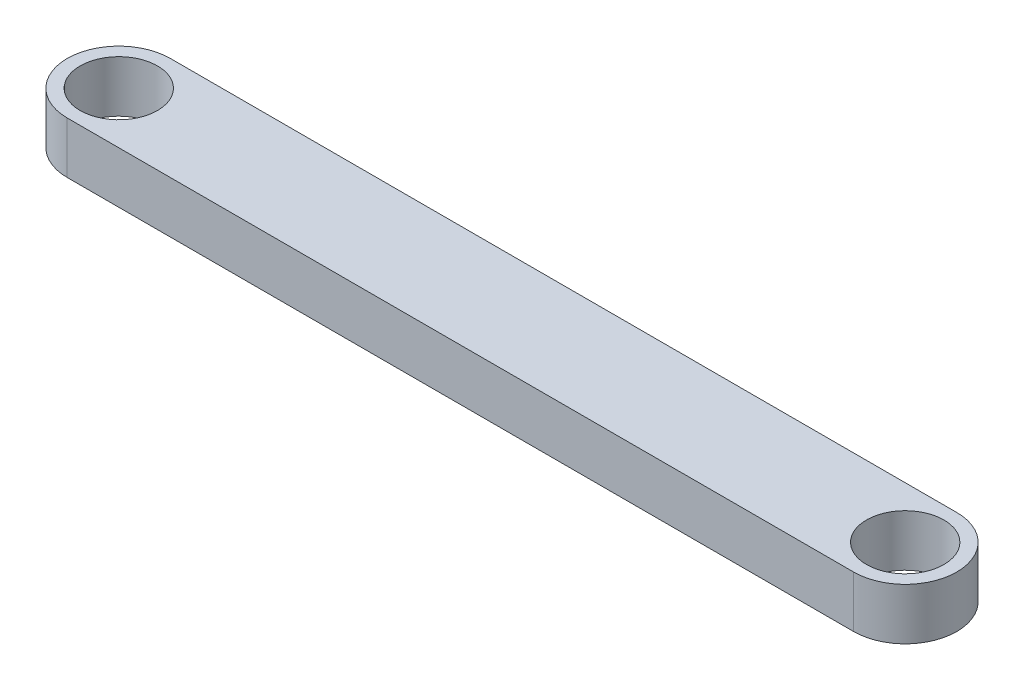
ISO-10303-21;
HEADER;
FILE_DESCRIPTION(('STEP AP214'),'2;1');
FILE_NAME('part.step','',(''),(''),'','','');
FILE_SCHEMA(('AUTOMOTIVE_DESIGN { 1 0 10303 214 1 1 1 1 }'));
ENDSEC;
DATA;
#1=APPLICATION_CONTEXT('core data for automotive mechanical design processes');
#2=APPLICATION_PROTOCOL_DEFINITION('international standard','automotive_design',2000,#1);
#3=PRODUCT_CONTEXT('',#1,'mechanical');
#4=PRODUCT('Part','Part','',(#3));
#5=PRODUCT_RELATED_PRODUCT_CATEGORY('part','',(#4));
#6=PRODUCT_DEFINITION_FORMATION('','',#4);
#7=PRODUCT_DEFINITION_CONTEXT('part definition',#1,'design');
#8=PRODUCT_DEFINITION('design','',#6,#7);
#9=PRODUCT_DEFINITION_SHAPE('','',#8);
#10=(LENGTH_UNIT() NAMED_UNIT(*) SI_UNIT(.MILLI.,.METRE.));
#11=(NAMED_UNIT(*) PLANE_ANGLE_UNIT() SI_UNIT($,.RADIAN.));
#12=(NAMED_UNIT(*) SI_UNIT($,.STERADIAN.) SOLID_ANGLE_UNIT());
#13=UNCERTAINTY_MEASURE_WITH_UNIT(LENGTH_MEASURE(1.E-05),#10,'distance_accuracy_value','');
#14=(GEOMETRIC_REPRESENTATION_CONTEXT(3) GLOBAL_UNCERTAINTY_ASSIGNED_CONTEXT((#13)) GLOBAL_UNIT_ASSIGNED_CONTEXT((#10,
#11,#12)) REPRESENTATION_CONTEXT('',''));
#15=CARTESIAN_POINT('',(0.,0.,0.));
#16=DIRECTION('',(0.,0.,1.));
#17=DIRECTION('',(1.,0.,0.));
#18=AXIS2_PLACEMENT_3D('',#15,#16,#17);
#19=CARTESIAN_POINT('',(-97.4301620899353,2.,-22.3368550491147));
#20=DIRECTION('',(0.,1.,0.));
#21=DIRECTION('',(0.,0.,1.));
#22=AXIS2_PLACEMENT_3D('',#19,#20,#21);
#23=PLANE('',#22);
#24=CARTESIAN_POINT('',(-97.4301620899353,2.,-22.3368550491147));
#25=DIRECTION('',(0.,1.,0.));
#26=DIRECTION('',(0.,0.,1.));
#27=AXIS2_PLACEMENT_3D('',#24,#25,#26);
#28=CIRCLE('',#27,1.5);
#29=CARTESIAN_POINT('',(-97.4301620899353,2.,-20.8368550491147));
#30=VERTEX_POINT('',#29);
#31=EDGE_CURVE('E104',#30,#30,#28,.T.);
#32=ORIENTED_EDGE('',*,*,#31,.F.);
#33=EDGE_LOOP('',(#32));
#34=FACE_BOUND('',#33,.T.);
#35=CARTESIAN_POINT('',(-97.4301620899353,2.,-22.3368550491147));
#36=DIRECTION('',(0.,1.,0.));
#37=DIRECTION('',(0.,0.,1.));
#38=AXIS2_PLACEMENT_3D('',#35,#36,#37);
#39=CIRCLE('',#38,1.99999999999999);
#40=CARTESIAN_POINT('',(-97.4301620899353,2.,-24.3368550491147));
#41=VERTEX_POINT('',#40);
#42=CARTESIAN_POINT('',(-97.4301620899353,2.,-20.3368550491147));
#43=VERTEX_POINT('',#42);
#44=EDGE_CURVE('E89',#41,#43,#39,.T.);
#45=ORIENTED_EDGE('',*,*,#44,.T.);
#46=DIRECTION('',(1.,0.,0.));
#47=VECTOR('',#46,1.);
#48=CARTESIAN_POINT('',(-66.9301620899353,2.,-20.3368550491147));
#49=LINE('',#48,#47);
#50=CARTESIAN_POINT('',(-66.9301620899353,2.,-20.3368550491147));
#51=VERTEX_POINT('',#50);
#52=EDGE_CURVE('E84',#43,#51,#49,.T.);
#53=ORIENTED_EDGE('',*,*,#52,.T.);
#54=CARTESIAN_POINT('',(-66.9301620899353,2.,-22.3368550491147));
#55=DIRECTION('',(0.,1.,0.));
#56=DIRECTION('',(0.,0.,1.));
#57=AXIS2_PLACEMENT_3D('',#54,#55,#56);
#58=CIRCLE('',#57,1.99999999999999);
#59=CARTESIAN_POINT('',(-66.9301620899353,2.,-24.3368550491147));
#60=VERTEX_POINT('',#59);
#61=EDGE_CURVE('E87',#51,#60,#58,.T.);
#62=ORIENTED_EDGE('',*,*,#61,.T.);
#63=DIRECTION('',(-1.,0.,0.));
#64=VECTOR('',#63,1.);
#65=CARTESIAN_POINT('',(-97.4301620899353,2.,-24.3368550491147));
#66=LINE('',#65,#64);
#67=EDGE_CURVE('E54',#60,#41,#66,.T.);
#68=ORIENTED_EDGE('',*,*,#67,.T.);
#69=EDGE_LOOP('',(#45,#53,#62,#68));
#70=FACE_BOUND('',#69,.T.);
#71=CARTESIAN_POINT('',(-66.9301620899353,2.,-22.3368550491147));
#72=DIRECTION('',(0.,1.,0.));
#73=DIRECTION('',(0.,0.,1.));
#74=AXIS2_PLACEMENT_3D('',#71,#72,#73);
#75=CIRCLE('',#74,1.5);
#76=CARTESIAN_POINT('',(-66.9301620899353,2.,-20.8368550491147));
#77=VERTEX_POINT('',#76);
#78=EDGE_CURVE('E119',#77,#77,#75,.T.);
#79=ORIENTED_EDGE('',*,*,#78,.F.);
#80=EDGE_LOOP('',(#79));
#81=FACE_BOUND('',#80,.T.);
#82=ADVANCED_FACE('F37',(#34,#70,#81),#23,.T.);
#83=CARTESIAN_POINT('',(-97.4301620899353,0.,-22.3368550491147));
#84=DIRECTION('',(0.,1.,0.));
#85=DIRECTION('',(0.,0.,1.));
#86=AXIS2_PLACEMENT_3D('',#83,#84,#85);
#87=PLANE('',#86);
#88=CARTESIAN_POINT('',(-97.4301620899353,0.,-22.3368550491147));
#89=DIRECTION('',(0.,1.,0.));
#90=DIRECTION('',(0.,0.,1.));
#91=AXIS2_PLACEMENT_3D('',#88,#89,#90);
#92=CIRCLE('',#91,1.99999999999999);
#93=CARTESIAN_POINT('',(-97.4301620899353,0.,-24.3368550491147));
#94=VERTEX_POINT('',#93);
#95=CARTESIAN_POINT('',(-97.4301620899353,0.,-20.3368550491147));
#96=VERTEX_POINT('',#95);
#97=EDGE_CURVE('E101',#94,#96,#92,.T.);
#98=ORIENTED_EDGE('',*,*,#97,.F.);
#99=DIRECTION('',(-1.,0.,0.));
#100=VECTOR('',#99,1.);
#101=CARTESIAN_POINT('',(-97.4301620899353,0.,-24.3368550491147));
#102=LINE('',#101,#100);
#103=CARTESIAN_POINT('',(-66.9301620899353,0.,-24.3368550491147));
#104=VERTEX_POINT('',#103);
#105=EDGE_CURVE('E77',#104,#94,#102,.T.);
#106=ORIENTED_EDGE('',*,*,#105,.F.);
#107=CARTESIAN_POINT('',(-66.9301620899353,0.,-22.3368550491147));
#108=DIRECTION('',(0.,1.,0.));
#109=DIRECTION('',(0.,0.,1.));
#110=AXIS2_PLACEMENT_3D('',#107,#108,#109);
#111=CIRCLE('',#110,1.99999999999999);
#112=CARTESIAN_POINT('',(-66.9301620899353,0.,-20.3368550491147));
#113=VERTEX_POINT('',#112);
#114=EDGE_CURVE('E71',#113,#104,#111,.T.);
#115=ORIENTED_EDGE('',*,*,#114,.F.);
#116=DIRECTION('',(1.,0.,0.));
#117=VECTOR('',#116,1.);
#118=CARTESIAN_POINT('',(-66.9301620899353,0.,-20.3368550491147));
#119=LINE('',#118,#117);
#120=EDGE_CURVE('E93',#96,#113,#119,.T.);
#121=ORIENTED_EDGE('',*,*,#120,.F.);
#122=EDGE_LOOP('',(#98,#106,#115,#121));
#123=FACE_BOUND('',#122,.T.);
#124=CARTESIAN_POINT('',(-97.4301620899353,0.,-22.3368550491147));
#125=DIRECTION('',(0.,1.,0.));
#126=DIRECTION('',(0.,0.,1.));
#127=AXIS2_PLACEMENT_3D('',#124,#125,#126);
#128=CIRCLE('',#127,1.5);
#129=CARTESIAN_POINT('',(-97.4301620899353,0.,-20.8368550491147));
#130=VERTEX_POINT('',#129);
#131=EDGE_CURVE('E116',#130,#130,#128,.T.);
#132=ORIENTED_EDGE('',*,*,#131,.T.);
#133=EDGE_LOOP('',(#132));
#134=FACE_BOUND('',#133,.T.);
#135=CARTESIAN_POINT('',(-66.9301620899353,0.,-22.3368550491147));
#136=DIRECTION('',(0.,1.,0.));
#137=DIRECTION('',(0.,0.,1.));
#138=AXIS2_PLACEMENT_3D('',#135,#136,#137);
#139=CIRCLE('',#138,1.5);
#140=CARTESIAN_POINT('',(-66.9301620899353,0.,-20.8368550491147));
#141=VERTEX_POINT('',#140);
#142=EDGE_CURVE('E122',#141,#141,#139,.T.);
#143=ORIENTED_EDGE('',*,*,#142,.T.);
#144=EDGE_LOOP('',(#143));
#145=FACE_BOUND('',#144,.T.);
#146=ADVANCED_FACE('F112',(#123,#134,#145),#87,.F.);
#147=CARTESIAN_POINT('',(-97.4301620899353,2.,-22.3368550491147));
#148=DIRECTION('',(0.,-1.,0.));
#149=DIRECTION('',(0.,0.,-1.));
#150=AXIS2_PLACEMENT_3D('',#147,#148,#149);
#151=CYLINDRICAL_SURFACE('',#150,1.99999999999999);
#152=ORIENTED_EDGE('',*,*,#97,.T.);
#153=DIRECTION('',(0.,-1.,0.));
#154=VECTOR('',#153,1.);
#155=CARTESIAN_POINT('',(-97.4301620899353,2.,-20.3368550491147));
#156=LINE('',#155,#154);
#157=EDGE_CURVE('E11',#43,#96,#156,.T.);
#158=ORIENTED_EDGE('',*,*,#157,.F.);
#159=ORIENTED_EDGE('',*,*,#44,.F.);
#160=DIRECTION('',(0.,-1.,0.));
#161=VECTOR('',#160,1.);
#162=CARTESIAN_POINT('',(-97.4301620899353,2.,-24.3368550491147));
#163=LINE('',#162,#161);
#164=EDGE_CURVE('E97',#41,#94,#163,.T.);
#165=ORIENTED_EDGE('',*,*,#164,.T.);
#166=EDGE_LOOP('',(#152,#158,#159,#165));
#167=FACE_BOUND('',#166,.T.);
#168=ADVANCED_FACE('F39',(#167),#151,.T.);
#169=CARTESIAN_POINT('',(-66.9301620899353,2.,-20.3368550491147));
#170=DIRECTION('',(0.,0.,-1.));
#171=DIRECTION('',(-1.,0.,0.));
#172=AXIS2_PLACEMENT_3D('',#169,#170,#171);
#173=PLANE('',#172);
#174=ORIENTED_EDGE('',*,*,#120,.T.);
#175=DIRECTION('',(0.,-1.,0.));
#176=VECTOR('',#175,1.);
#177=CARTESIAN_POINT('',(-66.9301620899353,2.,-20.3368550491147));
#178=LINE('',#177,#176);
#179=EDGE_CURVE('E46',#51,#113,#178,.T.);
#180=ORIENTED_EDGE('',*,*,#179,.F.);
#181=ORIENTED_EDGE('',*,*,#52,.F.);
#182=ORIENTED_EDGE('',*,*,#157,.T.);
#183=EDGE_LOOP('',(#174,#180,#181,#182));
#184=FACE_BOUND('',#183,.T.);
#185=ADVANCED_FACE('F92',(#184),#173,.F.);
#186=CARTESIAN_POINT('',(-66.9301620899353,2.,-22.3368550491147));
#187=DIRECTION('',(0.,-1.,0.));
#188=DIRECTION('',(0.,0.,-1.));
#189=AXIS2_PLACEMENT_3D('',#186,#187,#188);
#190=CYLINDRICAL_SURFACE('',#189,1.99999999999999);
#191=ORIENTED_EDGE('',*,*,#114,.T.);
#192=DIRECTION('',(0.,-1.,0.));
#193=VECTOR('',#192,1.);
#194=CARTESIAN_POINT('',(-66.9301620899353,2.,-24.3368550491147));
#195=LINE('',#194,#193);
#196=EDGE_CURVE('E94',#60,#104,#195,.T.);
#197=ORIENTED_EDGE('',*,*,#196,.F.);
#198=ORIENTED_EDGE('',*,*,#61,.F.);
#199=ORIENTED_EDGE('',*,*,#179,.T.);
#200=EDGE_LOOP('',(#191,#197,#198,#199));
#201=FACE_BOUND('',#200,.T.);
#202=ADVANCED_FACE('F95',(#201),#190,.T.);
#203=CARTESIAN_POINT('',(-97.4301620899353,2.,-24.3368550491147));
#204=DIRECTION('',(0.,0.,1.));
#205=DIRECTION('',(1.,0.,0.));
#206=AXIS2_PLACEMENT_3D('',#203,#204,#205);
#207=PLANE('',#206);
#208=ORIENTED_EDGE('',*,*,#105,.T.);
#209=ORIENTED_EDGE('',*,*,#164,.F.);
#210=ORIENTED_EDGE('',*,*,#67,.F.);
#211=ORIENTED_EDGE('',*,*,#196,.T.);
#212=EDGE_LOOP('',(#208,#209,#210,#211));
#213=FACE_BOUND('',#212,.T.);
#214=ADVANCED_FACE('F109',(#213),#207,.F.);
#215=CARTESIAN_POINT('',(-97.4301620899353,2.,-22.3368550491147));
#216=DIRECTION('',(0.,-1.,0.));
#217=DIRECTION('',(0.,0.,-1.));
#218=AXIS2_PLACEMENT_3D('',#215,#216,#217);
#219=CYLINDRICAL_SURFACE('',#218,1.5);
#220=ORIENTED_EDGE('',*,*,#31,.T.);
#221=EDGE_LOOP('',(#220));
#222=FACE_BOUND('',#221,.T.);
#223=ORIENTED_EDGE('',*,*,#131,.F.);
#224=EDGE_LOOP('',(#223));
#225=FACE_BOUND('',#224,.T.);
#226=ADVANCED_FACE('F139',(#222,#225),#219,.F.);
#227=CARTESIAN_POINT('',(-66.9301620899353,2.,-22.3368550491147));
#228=DIRECTION('',(0.,-1.,0.));
#229=DIRECTION('',(0.,0.,-1.));
#230=AXIS2_PLACEMENT_3D('',#227,#228,#229);
#231=CYLINDRICAL_SURFACE('',#230,1.5);
#232=ORIENTED_EDGE('',*,*,#78,.T.);
#233=EDGE_LOOP('',(#232));
#234=FACE_BOUND('',#233,.T.);
#235=ORIENTED_EDGE('',*,*,#142,.F.);
#236=EDGE_LOOP('',(#235));
#237=FACE_BOUND('',#236,.T.);
#238=ADVANCED_FACE('F128',(#234,#237),#231,.F.);
#239=CLOSED_SHELL('',(#82,#146,#168,#185,#202,#214,#226,#238));
#240=MANIFOLD_SOLID_BREP('B2',#239);
#241=ADVANCED_BREP_SHAPE_REPRESENTATION('',(#18,#240),#14);
#242=SHAPE_DEFINITION_REPRESENTATION(#9,#241);
ENDSEC;
END-ISO-10303-21;
